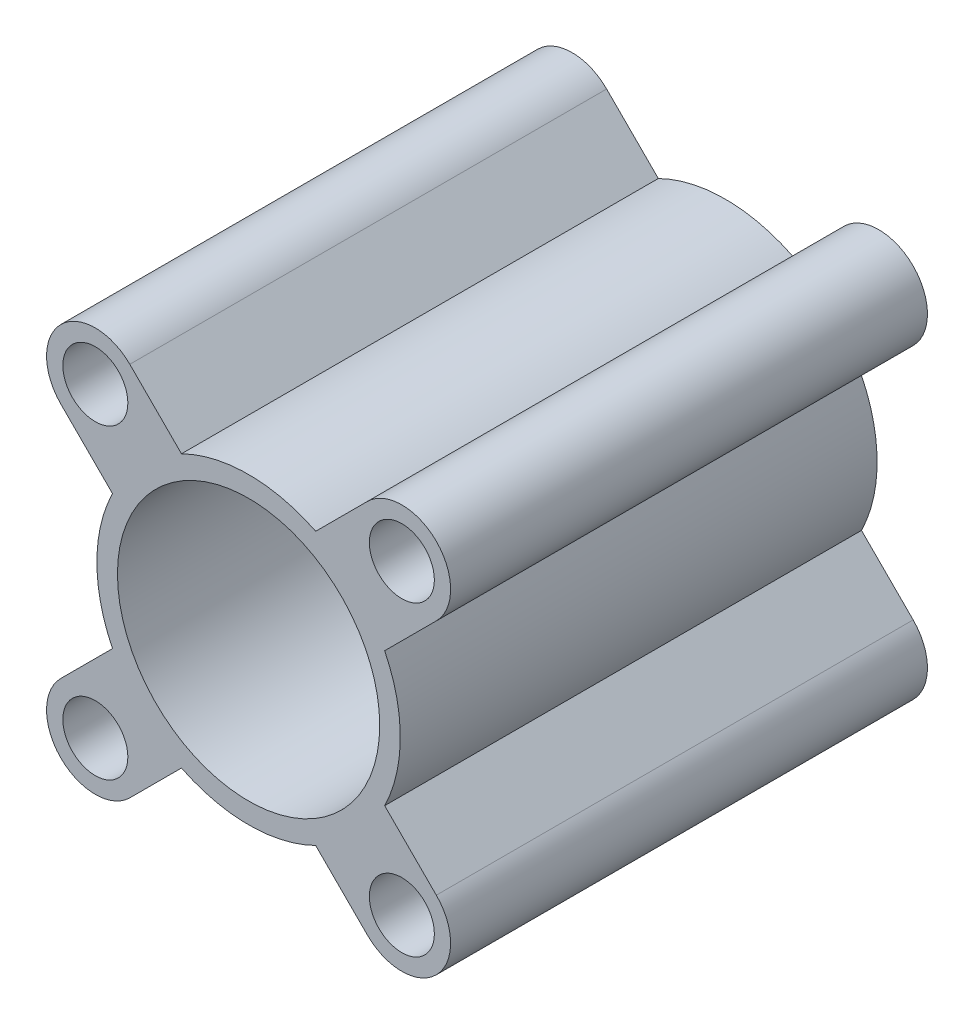
ISO-10303-21;
HEADER;
FILE_DESCRIPTION(('STEP AP214'),'2;1');
FILE_NAME('part.step','',(''),(''),'','','');
FILE_SCHEMA(('AUTOMOTIVE_DESIGN { 1 0 10303 214 1 1 1 1 }'));
ENDSEC;
DATA;
#1=APPLICATION_CONTEXT('core data for automotive mechanical design processes');
#2=APPLICATION_PROTOCOL_DEFINITION('international standard','automotive_design',2000,#1);
#3=PRODUCT_CONTEXT('',#1,'mechanical');
#4=PRODUCT('Part','Part','',(#3));
#5=PRODUCT_RELATED_PRODUCT_CATEGORY('part','',(#4));
#6=PRODUCT_DEFINITION_FORMATION('','',#4);
#7=PRODUCT_DEFINITION_CONTEXT('part definition',#1,'design');
#8=PRODUCT_DEFINITION('design','',#6,#7);
#9=PRODUCT_DEFINITION_SHAPE('','',#8);
#10=(LENGTH_UNIT() NAMED_UNIT(*) SI_UNIT(.MILLI.,.METRE.));
#11=(NAMED_UNIT(*) PLANE_ANGLE_UNIT() SI_UNIT($,.RADIAN.));
#12=(NAMED_UNIT(*) SI_UNIT($,.STERADIAN.) SOLID_ANGLE_UNIT());
#13=UNCERTAINTY_MEASURE_WITH_UNIT(LENGTH_MEASURE(1.E-05),#10,'distance_accuracy_value','');
#14=(GEOMETRIC_REPRESENTATION_CONTEXT(3) GLOBAL_UNCERTAINTY_ASSIGNED_CONTEXT((#13)) GLOBAL_UNIT_ASSIGNED_CONTEXT((#10,
#11,#12)) REPRESENTATION_CONTEXT('',''));
#15=CARTESIAN_POINT('',(0.,0.,0.));
#16=DIRECTION('',(0.,0.,1.));
#17=DIRECTION('',(1.,0.,0.));
#18=AXIS2_PLACEMENT_3D('',#15,#16,#17);
#19=CARTESIAN_POINT('',(1.59092777800197,1.59092777800199,22.));
#20=DIRECTION('',(0.707106781186543,0.707106781186552,0.));
#21=DIRECTION('',(-0.707106781186552,0.707106781186543,0.));
#22=AXIS2_PLACEMENT_3D('',#19,#20,#21);
#23=PLANE('',#22);
#24=DIRECTION('',(0.707106781186552,-0.707106781186543,0.));
#25=VECTOR('',#24,1.);
#26=CARTESIAN_POINT('',(1.59092777800197,1.59092777800199,0.));
#27=LINE('',#26,#25);
#28=CARTESIAN_POINT('',(-5.48014003386354,8.66199558986743,0.));
#29=VERTEX_POINT('',#28);
#30=CARTESIAN_POINT('',(-3.09617674453451,6.27803230053842,0.));
#31=VERTEX_POINT('',#30);
#32=EDGE_CURVE('E220',#29,#31,#27,.T.);
#33=ORIENTED_EDGE('',*,*,#32,.F.);
#34=DIRECTION('',(0.,0.,-1.));
#35=VECTOR('',#34,1.);
#36=CARTESIAN_POINT('',(-5.48014003386354,8.66199558986743,22.));
#37=LINE('',#36,#35);
#38=CARTESIAN_POINT('',(-5.48014003386354,8.66199558986743,22.));
#39=VERTEX_POINT('',#38);
#40=EDGE_CURVE('E11',#39,#29,#37,.T.);
#41=ORIENTED_EDGE('',*,*,#40,.F.);
#42=DIRECTION('',(0.707106781186552,-0.707106781186543,0.));
#43=VECTOR('',#42,1.);
#44=CARTESIAN_POINT('',(1.59092777800197,1.59092777800199,22.));
#45=LINE('',#44,#43);
#46=CARTESIAN_POINT('',(-3.09617674453451,6.27803230053842,22.));
#47=VERTEX_POINT('',#46);
#48=EDGE_CURVE('E376',#39,#47,#45,.T.);
#49=ORIENTED_EDGE('',*,*,#48,.T.);
#50=DIRECTION('',(0.,0.,-1.));
#51=VECTOR('',#50,1.);
#52=CARTESIAN_POINT('',(-3.09617674453451,6.27803230053842,22.));
#53=LINE('',#52,#51);
#54=EDGE_CURVE('E110',#47,#31,#53,.T.);
#55=ORIENTED_EDGE('',*,*,#54,.T.);
#56=EDGE_LOOP('',(#33,#41,#49,#55));
#57=FACE_BOUND('',#56,.T.);
#58=ADVANCED_FACE('F35',(#57),#23,.T.);
#59=CARTESIAN_POINT('',(-7.07106781186552,7.07106781186544,22.));
#60=DIRECTION('',(0.,0.,-1.));
#61=DIRECTION('',(-1.,0.,0.));
#62=AXIS2_PLACEMENT_3D('',#59,#60,#61);
#63=CYLINDRICAL_SURFACE('',#62,2.24991164040649);
#64=CARTESIAN_POINT('',(-7.07106781186552,7.07106781186544,0.));
#65=DIRECTION('',(0.,0.,1.));
#66=DIRECTION('',(1.,0.,0.));
#67=AXIS2_PLACEMENT_3D('',#64,#65,#66);
#68=CIRCLE('',#67,2.24991164040649);
#69=CARTESIAN_POINT('',(-8.66199558986749,5.48014003386345,0.));
#70=VERTEX_POINT('',#69);
#71=EDGE_CURVE('E218',#29,#70,#68,.T.);
#72=ORIENTED_EDGE('',*,*,#71,.T.);
#73=DIRECTION('',(0.,0.,-1.));
#74=VECTOR('',#73,1.);
#75=CARTESIAN_POINT('',(-8.66199558986749,5.48014003386345,22.));
#76=LINE('',#75,#74);
#77=CARTESIAN_POINT('',(-8.66199558986749,5.48014003386345,22.));
#78=VERTEX_POINT('',#77);
#79=EDGE_CURVE('E44',#78,#70,#76,.T.);
#80=ORIENTED_EDGE('',*,*,#79,.F.);
#81=CARTESIAN_POINT('',(-7.07106781186552,7.07106781186544,22.));
#82=DIRECTION('',(0.,0.,1.));
#83=DIRECTION('',(1.,0.,0.));
#84=AXIS2_PLACEMENT_3D('',#81,#82,#83);
#85=CIRCLE('',#84,2.24991164040649);
#86=EDGE_CURVE('E378',#39,#78,#85,.T.);
#87=ORIENTED_EDGE('',*,*,#86,.F.);
#88=ORIENTED_EDGE('',*,*,#40,.T.);
#89=EDGE_LOOP('',(#72,#80,#87,#88));
#90=FACE_BOUND('',#89,.T.);
#91=ADVANCED_FACE('F219',(#90),#63,.T.);
#92=CARTESIAN_POINT('',(-1.59092777800198,-1.59092777800199,22.));
#93=DIRECTION('',(0.707106781186544,0.707106781186551,0.));
#94=DIRECTION('',(-0.707106781186551,0.707106781186544,0.));
#95=AXIS2_PLACEMENT_3D('',#92,#93,#94);
#96=PLANE('',#95);
#97=DIRECTION('',(0.707106781186551,-0.707106781186544,0.));
#98=VECTOR('',#97,1.);
#99=CARTESIAN_POINT('',(-1.59092777800198,-1.59092777800199,0.));
#100=LINE('',#99,#98);
#101=CARTESIAN_POINT('',(-6.27803230053845,3.09617674453444,0.));
#102=VERTEX_POINT('',#101);
#103=EDGE_CURVE('E212',#70,#102,#100,.T.);
#104=ORIENTED_EDGE('',*,*,#103,.T.);
#105=DIRECTION('',(0.,0.,-1.));
#106=VECTOR('',#105,1.);
#107=CARTESIAN_POINT('',(-6.27803230053845,3.09617674453444,22.));
#108=LINE('',#107,#106);
#109=CARTESIAN_POINT('',(-6.27803230053845,3.09617674453444,22.));
#110=VERTEX_POINT('',#109);
#111=EDGE_CURVE('E203',#110,#102,#108,.T.);
#112=ORIENTED_EDGE('',*,*,#111,.F.);
#113=DIRECTION('',(0.707106781186551,-0.707106781186544,0.));
#114=VECTOR('',#113,1.);
#115=CARTESIAN_POINT('',(-1.59092777800198,-1.59092777800199,22.));
#116=LINE('',#115,#114);
#117=EDGE_CURVE('E214',#78,#110,#116,.T.);
#118=ORIENTED_EDGE('',*,*,#117,.F.);
#119=ORIENTED_EDGE('',*,*,#79,.T.);
#120=EDGE_LOOP('',(#104,#112,#118,#119));
#121=FACE_BOUND('',#120,.T.);
#122=ADVANCED_FACE('F210',(#121),#96,.F.);
#123=CARTESIAN_POINT('',(0.,0.,22.));
#124=DIRECTION('',(0.,0.,-1.));
#125=DIRECTION('',(-1.,0.,0.));
#126=AXIS2_PLACEMENT_3D('',#123,#124,#125);
#127=CYLINDRICAL_SURFACE('',#126,7.);
#128=CARTESIAN_POINT('',(0.,0.,0.));
#129=DIRECTION('',(0.,0.,1.));
#130=DIRECTION('',(1.,0.,0.));
#131=AXIS2_PLACEMENT_3D('',#128,#129,#130);
#132=CIRCLE('',#131,7.);
#133=CARTESIAN_POINT('',(-6.27803230053842,-3.0961767445345,0.));
#134=VERTEX_POINT('',#133);
#135=EDGE_CURVE('E222',#102,#134,#132,.T.);
#136=ORIENTED_EDGE('',*,*,#135,.T.);
#137=DIRECTION('',(0.,0.,-1.));
#138=VECTOR('',#137,1.);
#139=CARTESIAN_POINT('',(-6.27803230053842,-3.0961767445345,22.));
#140=LINE('',#139,#138);
#141=CARTESIAN_POINT('',(-6.27803230053842,-3.0961767445345,22.));
#142=VERTEX_POINT('',#141);
#143=EDGE_CURVE('E201',#142,#134,#140,.T.);
#144=ORIENTED_EDGE('',*,*,#143,.F.);
#145=CARTESIAN_POINT('',(0.,0.,22.));
#146=DIRECTION('',(0.,0.,1.));
#147=DIRECTION('',(1.,0.,0.));
#148=AXIS2_PLACEMENT_3D('',#145,#146,#147);
#149=CIRCLE('',#148,7.);
#150=EDGE_CURVE('E384',#110,#142,#149,.T.);
#151=ORIENTED_EDGE('',*,*,#150,.F.);
#152=ORIENTED_EDGE('',*,*,#111,.T.);
#153=EDGE_LOOP('',(#136,#144,#151,#152));
#154=FACE_BOUND('',#153,.T.);
#155=ADVANCED_FACE('F311',(#154),#127,.T.);
#156=CARTESIAN_POINT('',(-1.590927778002,1.59092777800198,22.));
#157=DIRECTION('',(-0.707106781186552,0.707106781186543,0.));
#158=DIRECTION('',(-0.707106781186543,-0.707106781186552,0.));
#159=AXIS2_PLACEMENT_3D('',#156,#157,#158);
#160=PLANE('',#159);
#161=DIRECTION('',(0.707106781186543,0.707106781186552,0.));
#162=VECTOR('',#161,1.);
#163=CARTESIAN_POINT('',(-1.590927778002,1.59092777800198,0.));
#164=LINE('',#163,#162);
#165=CARTESIAN_POINT('',(-8.66199558986743,-5.48014003386354,0.));
#166=VERTEX_POINT('',#165);
#167=EDGE_CURVE('E230',#166,#134,#164,.T.);
#168=ORIENTED_EDGE('',*,*,#167,.F.);
#169=DIRECTION('',(0.,0.,-1.));
#170=VECTOR('',#169,1.);
#171=CARTESIAN_POINT('',(-8.66199558986743,-5.48014003386354,22.));
#172=LINE('',#171,#170);
#173=CARTESIAN_POINT('',(-8.66199558986743,-5.48014003386354,22.));
#174=VERTEX_POINT('',#173);
#175=EDGE_CURVE('E199',#174,#166,#172,.T.);
#176=ORIENTED_EDGE('',*,*,#175,.F.);
#177=DIRECTION('',(0.707106781186543,0.707106781186552,0.));
#178=VECTOR('',#177,1.);
#179=CARTESIAN_POINT('',(-1.590927778002,1.59092777800198,22.));
#180=LINE('',#179,#178);
#181=EDGE_CURVE('E386',#174,#142,#180,.T.);
#182=ORIENTED_EDGE('',*,*,#181,.T.);
#183=ORIENTED_EDGE('',*,*,#143,.T.);
#184=EDGE_LOOP('',(#168,#176,#182,#183));
#185=FACE_BOUND('',#184,.T.);
#186=ADVANCED_FACE('F314',(#185),#160,.T.);
#187=CARTESIAN_POINT('',(-7.07106781186544,-7.07106781186552,22.));
#188=DIRECTION('',(0.,0.,-1.));
#189=DIRECTION('',(-1.,0.,0.));
#190=AXIS2_PLACEMENT_3D('',#187,#188,#189);
#191=CYLINDRICAL_SURFACE('',#190,2.2499116404065);
#192=CARTESIAN_POINT('',(-7.07106781186544,-7.07106781186552,0.));
#193=DIRECTION('',(0.,0.,1.));
#194=DIRECTION('',(1.,0.,0.));
#195=AXIS2_PLACEMENT_3D('',#192,#193,#194);
#196=CIRCLE('',#195,2.2499116404065);
#197=CARTESIAN_POINT('',(-5.48014003386344,-8.66199558986749,0.));
#198=VERTEX_POINT('',#197);
#199=EDGE_CURVE('E233',#166,#198,#196,.T.);
#200=ORIENTED_EDGE('',*,*,#199,.T.);
#201=DIRECTION('',(0.,0.,-1.));
#202=VECTOR('',#201,1.);
#203=CARTESIAN_POINT('',(-5.48014003386344,-8.66199558986749,22.));
#204=LINE('',#203,#202);
#205=CARTESIAN_POINT('',(-5.48014003386344,-8.66199558986749,22.));
#206=VERTEX_POINT('',#205);
#207=EDGE_CURVE('E196',#206,#198,#204,.T.);
#208=ORIENTED_EDGE('',*,*,#207,.F.);
#209=CARTESIAN_POINT('',(-7.07106781186544,-7.07106781186552,22.));
#210=DIRECTION('',(0.,0.,1.));
#211=DIRECTION('',(1.,0.,0.));
#212=AXIS2_PLACEMENT_3D('',#209,#210,#211);
#213=CIRCLE('',#212,2.2499116404065);
#214=EDGE_CURVE('E389',#174,#206,#213,.T.);
#215=ORIENTED_EDGE('',*,*,#214,.F.);
#216=ORIENTED_EDGE('',*,*,#175,.T.);
#217=EDGE_LOOP('',(#200,#208,#215,#216));
#218=FACE_BOUND('',#217,.T.);
#219=ADVANCED_FACE('F318',(#218),#191,.T.);
#220=CARTESIAN_POINT('',(1.59092777800199,-1.59092777800198,22.));
#221=DIRECTION('',(-0.707106781186552,0.707106781186543,0.));
#222=DIRECTION('',(-0.707106781186543,-0.707106781186552,0.));
#223=AXIS2_PLACEMENT_3D('',#220,#221,#222);
#224=PLANE('',#223);
#225=DIRECTION('',(0.707106781186543,0.707106781186552,0.));
#226=VECTOR('',#225,1.);
#227=CARTESIAN_POINT('',(1.59092777800199,-1.59092777800198,0.));
#228=LINE('',#227,#226);
#229=CARTESIAN_POINT('',(-3.09617674453443,-6.27803230053846,0.));
#230=VERTEX_POINT('',#229);
#231=EDGE_CURVE('E236',#198,#230,#228,.T.);
#232=ORIENTED_EDGE('',*,*,#231,.T.);
#233=DIRECTION('',(0.,0.,-1.));
#234=VECTOR('',#233,1.);
#235=CARTESIAN_POINT('',(-3.09617674453443,-6.27803230053846,22.));
#236=LINE('',#235,#234);
#237=CARTESIAN_POINT('',(-3.09617674453443,-6.27803230053846,22.));
#238=VERTEX_POINT('',#237);
#239=EDGE_CURVE('E193',#238,#230,#236,.T.);
#240=ORIENTED_EDGE('',*,*,#239,.F.);
#241=DIRECTION('',(0.707106781186543,0.707106781186552,0.));
#242=VECTOR('',#241,1.);
#243=CARTESIAN_POINT('',(1.59092777800199,-1.59092777800198,22.));
#244=LINE('',#243,#242);
#245=EDGE_CURVE('E392',#206,#238,#244,.T.);
#246=ORIENTED_EDGE('',*,*,#245,.F.);
#247=ORIENTED_EDGE('',*,*,#207,.T.);
#248=EDGE_LOOP('',(#232,#240,#246,#247));
#249=FACE_BOUND('',#248,.T.);
#250=ADVANCED_FACE('F322',(#249),#224,.F.);
#251=CARTESIAN_POINT('',(0.,0.,22.));
#252=DIRECTION('',(0.,0.,-1.));
#253=DIRECTION('',(-1.,0.,0.));
#254=AXIS2_PLACEMENT_3D('',#251,#252,#253);
#255=CYLINDRICAL_SURFACE('',#254,7.);
#256=CARTESIAN_POINT('',(0.,0.,0.));
#257=DIRECTION('',(0.,0.,1.));
#258=DIRECTION('',(1.,0.,0.));
#259=AXIS2_PLACEMENT_3D('',#256,#257,#258);
#260=CIRCLE('',#259,7.);
#261=CARTESIAN_POINT('',(3.0961767445345,-6.27803230053842,0.));
#262=VERTEX_POINT('',#261);
#263=EDGE_CURVE('E239',#230,#262,#260,.T.);
#264=ORIENTED_EDGE('',*,*,#263,.T.);
#265=DIRECTION('',(0.,0.,-1.));
#266=VECTOR('',#265,1.);
#267=CARTESIAN_POINT('',(3.0961767445345,-6.27803230053842,22.));
#268=LINE('',#267,#266);
#269=CARTESIAN_POINT('',(3.0961767445345,-6.27803230053842,22.));
#270=VERTEX_POINT('',#269);
#271=EDGE_CURVE('E191',#270,#262,#268,.T.);
#272=ORIENTED_EDGE('',*,*,#271,.F.);
#273=CARTESIAN_POINT('',(0.,0.,22.));
#274=DIRECTION('',(0.,0.,1.));
#275=DIRECTION('',(1.,0.,0.));
#276=AXIS2_PLACEMENT_3D('',#273,#274,#275);
#277=CIRCLE('',#276,7.);
#278=EDGE_CURVE('E395',#238,#270,#277,.T.);
#279=ORIENTED_EDGE('',*,*,#278,.F.);
#280=ORIENTED_EDGE('',*,*,#239,.T.);
#281=EDGE_LOOP('',(#264,#272,#279,#280));
#282=FACE_BOUND('',#281,.T.);
#283=ADVANCED_FACE('F326',(#282),#255,.T.);
#284=CARTESIAN_POINT('',(-1.59092777800198,-1.59092777800199,22.));
#285=DIRECTION('',(-0.707106781186543,-0.707106781186552,0.));
#286=DIRECTION('',(0.707106781186552,-0.707106781186543,0.));
#287=AXIS2_PLACEMENT_3D('',#284,#285,#286);
#288=PLANE('',#287);
#289=DIRECTION('',(-0.707106781186552,0.707106781186543,0.));
#290=VECTOR('',#289,1.);
#291=CARTESIAN_POINT('',(-1.59092777800198,-1.59092777800199,0.));
#292=LINE('',#291,#290);
#293=CARTESIAN_POINT('',(5.48014003386354,-8.66199558986743,0.));
#294=VERTEX_POINT('',#293);
#295=EDGE_CURVE('E242',#294,#262,#292,.T.);
#296=ORIENTED_EDGE('',*,*,#295,.F.);
#297=DIRECTION('',(0.,0.,-1.));
#298=VECTOR('',#297,1.);
#299=CARTESIAN_POINT('',(5.48014003386354,-8.66199558986743,22.));
#300=LINE('',#299,#298);
#301=CARTESIAN_POINT('',(5.48014003386354,-8.66199558986743,22.));
#302=VERTEX_POINT('',#301);
#303=EDGE_CURVE('E189',#302,#294,#300,.T.);
#304=ORIENTED_EDGE('',*,*,#303,.F.);
#305=DIRECTION('',(-0.707106781186552,0.707106781186543,0.));
#306=VECTOR('',#305,1.);
#307=CARTESIAN_POINT('',(-1.59092777800198,-1.59092777800199,22.));
#308=LINE('',#307,#306);
#309=EDGE_CURVE('E397',#302,#270,#308,.T.);
#310=ORIENTED_EDGE('',*,*,#309,.T.);
#311=ORIENTED_EDGE('',*,*,#271,.T.);
#312=EDGE_LOOP('',(#296,#304,#310,#311));
#313=FACE_BOUND('',#312,.T.);
#314=ADVANCED_FACE('F330',(#313),#288,.T.);
#315=CARTESIAN_POINT('',(7.07106781186552,-7.07106781186544,22.));
#316=DIRECTION('',(0.,0.,-1.));
#317=DIRECTION('',(-1.,0.,0.));
#318=AXIS2_PLACEMENT_3D('',#315,#316,#317);
#319=CYLINDRICAL_SURFACE('',#318,2.2499116404065);
#320=CARTESIAN_POINT('',(7.07106781186552,-7.07106781186544,0.));
#321=DIRECTION('',(0.,0.,1.));
#322=DIRECTION('',(1.,0.,0.));
#323=AXIS2_PLACEMENT_3D('',#320,#321,#322);
#324=CIRCLE('',#323,2.2499116404065);
#325=CARTESIAN_POINT('',(8.66199558986749,-5.48014003386344,0.));
#326=VERTEX_POINT('',#325);
#327=EDGE_CURVE('E245',#294,#326,#324,.T.);
#328=ORIENTED_EDGE('',*,*,#327,.T.);
#329=DIRECTION('',(0.,0.,-1.));
#330=VECTOR('',#329,1.);
#331=CARTESIAN_POINT('',(8.66199558986749,-5.48014003386344,22.));
#332=LINE('',#331,#330);
#333=CARTESIAN_POINT('',(8.66199558986749,-5.48014003386344,22.));
#334=VERTEX_POINT('',#333);
#335=EDGE_CURVE('E186',#334,#326,#332,.T.);
#336=ORIENTED_EDGE('',*,*,#335,.F.);
#337=CARTESIAN_POINT('',(7.07106781186552,-7.07106781186544,22.));
#338=DIRECTION('',(0.,0.,1.));
#339=DIRECTION('',(1.,0.,0.));
#340=AXIS2_PLACEMENT_3D('',#337,#338,#339);
#341=CIRCLE('',#340,2.2499116404065);
#342=EDGE_CURVE('E400',#302,#334,#341,.T.);
#343=ORIENTED_EDGE('',*,*,#342,.F.);
#344=ORIENTED_EDGE('',*,*,#303,.T.);
#345=EDGE_LOOP('',(#328,#336,#343,#344));
#346=FACE_BOUND('',#345,.T.);
#347=ADVANCED_FACE('F334',(#346),#319,.T.);
#348=CARTESIAN_POINT('',(1.59092777800197,1.59092777800199,22.));
#349=DIRECTION('',(-0.707106781186543,-0.707106781186552,0.));
#350=DIRECTION('',(0.707106781186552,-0.707106781186543,0.));
#351=AXIS2_PLACEMENT_3D('',#348,#349,#350);
#352=PLANE('',#351);
#353=DIRECTION('',(-0.707106781186552,0.707106781186543,0.));
#354=VECTOR('',#353,1.);
#355=CARTESIAN_POINT('',(1.59092777800197,1.59092777800199,0.));
#356=LINE('',#355,#354);
#357=CARTESIAN_POINT('',(6.27803230053846,-3.09617674453443,0.));
#358=VERTEX_POINT('',#357);
#359=EDGE_CURVE('E248',#326,#358,#356,.T.);
#360=ORIENTED_EDGE('',*,*,#359,.T.);
#361=DIRECTION('',(0.,0.,-1.));
#362=VECTOR('',#361,1.);
#363=CARTESIAN_POINT('',(6.27803230053846,-3.09617674453443,22.));
#364=LINE('',#363,#362);
#365=CARTESIAN_POINT('',(6.27803230053846,-3.09617674453443,22.));
#366=VERTEX_POINT('',#365);
#367=EDGE_CURVE('E183',#366,#358,#364,.T.);
#368=ORIENTED_EDGE('',*,*,#367,.F.);
#369=DIRECTION('',(-0.707106781186552,0.707106781186543,0.));
#370=VECTOR('',#369,1.);
#371=CARTESIAN_POINT('',(1.59092777800197,1.59092777800199,22.));
#372=LINE('',#371,#370);
#373=EDGE_CURVE('E403',#334,#366,#372,.T.);
#374=ORIENTED_EDGE('',*,*,#373,.F.);
#375=ORIENTED_EDGE('',*,*,#335,.T.);
#376=EDGE_LOOP('',(#360,#368,#374,#375));
#377=FACE_BOUND('',#376,.T.);
#378=ADVANCED_FACE('F338',(#377),#352,.F.);
#379=CARTESIAN_POINT('',(0.,0.,22.));
#380=DIRECTION('',(0.,0.,-1.));
#381=DIRECTION('',(-1.,0.,0.));
#382=AXIS2_PLACEMENT_3D('',#379,#380,#381);
#383=CYLINDRICAL_SURFACE('',#382,7.);
#384=CARTESIAN_POINT('',(0.,0.,0.));
#385=DIRECTION('',(0.,0.,1.));
#386=DIRECTION('',(1.,0.,0.));
#387=AXIS2_PLACEMENT_3D('',#384,#385,#386);
#388=CIRCLE('',#387,7.);
#389=CARTESIAN_POINT('',(6.27803230053842,3.0961767445345,0.));
#390=VERTEX_POINT('',#389);
#391=EDGE_CURVE('E251',#358,#390,#388,.T.);
#392=ORIENTED_EDGE('',*,*,#391,.T.);
#393=DIRECTION('',(0.,0.,-1.));
#394=VECTOR('',#393,1.);
#395=CARTESIAN_POINT('',(6.27803230053842,3.0961767445345,22.));
#396=LINE('',#395,#394);
#397=CARTESIAN_POINT('',(6.27803230053842,3.0961767445345,22.));
#398=VERTEX_POINT('',#397);
#399=EDGE_CURVE('E177',#398,#390,#396,.T.);
#400=ORIENTED_EDGE('',*,*,#399,.F.);
#401=CARTESIAN_POINT('',(0.,0.,22.));
#402=DIRECTION('',(0.,0.,1.));
#403=DIRECTION('',(1.,0.,0.));
#404=AXIS2_PLACEMENT_3D('',#401,#402,#403);
#405=CIRCLE('',#404,7.);
#406=EDGE_CURVE('E406',#366,#398,#405,.T.);
#407=ORIENTED_EDGE('',*,*,#406,.F.);
#408=ORIENTED_EDGE('',*,*,#367,.T.);
#409=EDGE_LOOP('',(#392,#400,#407,#408));
#410=FACE_BOUND('',#409,.T.);
#411=ADVANCED_FACE('F342',(#410),#383,.T.);
#412=CARTESIAN_POINT('',(1.590927778002,-1.59092777800198,22.));
#413=DIRECTION('',(0.707106781186552,-0.707106781186543,0.));
#414=DIRECTION('',(0.707106781186543,0.707106781186552,0.));
#415=AXIS2_PLACEMENT_3D('',#412,#413,#414);
#416=PLANE('',#415);
#417=DIRECTION('',(-0.707106781186543,-0.707106781186552,0.));
#418=VECTOR('',#417,1.);
#419=CARTESIAN_POINT('',(1.590927778002,-1.59092777800198,0.));
#420=LINE('',#419,#418);
#421=CARTESIAN_POINT('',(8.66199558986743,5.48014003386354,0.));
#422=VERTEX_POINT('',#421);
#423=EDGE_CURVE('E254',#422,#390,#420,.T.);
#424=ORIENTED_EDGE('',*,*,#423,.F.);
#425=DIRECTION('',(0.,0.,-1.));
#426=VECTOR('',#425,1.);
#427=CARTESIAN_POINT('',(8.66199558986743,5.48014003386354,22.));
#428=LINE('',#427,#426);
#429=CARTESIAN_POINT('',(8.66199558986743,5.48014003386354,22.));
#430=VERTEX_POINT('',#429);
#431=EDGE_CURVE('E175',#430,#422,#428,.T.);
#432=ORIENTED_EDGE('',*,*,#431,.F.);
#433=DIRECTION('',(-0.707106781186543,-0.707106781186552,0.));
#434=VECTOR('',#433,1.);
#435=CARTESIAN_POINT('',(1.590927778002,-1.59092777800198,22.));
#436=LINE('',#435,#434);
#437=EDGE_CURVE('E169',#430,#398,#436,.T.);
#438=ORIENTED_EDGE('',*,*,#437,.T.);
#439=ORIENTED_EDGE('',*,*,#399,.T.);
#440=EDGE_LOOP('',(#424,#432,#438,#439));
#441=FACE_BOUND('',#440,.T.);
#442=ADVANCED_FACE('F346',(#441),#416,.T.);
#443=CARTESIAN_POINT('',(7.07106781186544,7.07106781186552,22.));
#444=DIRECTION('',(0.,0.,-1.));
#445=DIRECTION('',(-1.,0.,0.));
#446=AXIS2_PLACEMENT_3D('',#443,#444,#445);
#447=CYLINDRICAL_SURFACE('',#446,2.24991164040651);
#448=CARTESIAN_POINT('',(7.07106781186544,7.07106781186552,0.));
#449=DIRECTION('',(0.,0.,1.));
#450=DIRECTION('',(1.,0.,0.));
#451=AXIS2_PLACEMENT_3D('',#448,#449,#450);
#452=CIRCLE('',#451,2.24991164040651);
#453=CARTESIAN_POINT('',(5.48014003386343,8.6619955898675,0.));
#454=VERTEX_POINT('',#453);
#455=EDGE_CURVE('E174',#422,#454,#452,.T.);
#456=ORIENTED_EDGE('',*,*,#455,.T.);
#457=DIRECTION('',(0.,0.,-1.));
#458=VECTOR('',#457,1.);
#459=CARTESIAN_POINT('',(5.48014003386343,8.6619955898675,22.));
#460=LINE('',#459,#458);
#461=CARTESIAN_POINT('',(5.48014003386343,8.6619955898675,22.));
#462=VERTEX_POINT('',#461);
#463=EDGE_CURVE('E159',#462,#454,#460,.T.);
#464=ORIENTED_EDGE('',*,*,#463,.F.);
#465=CARTESIAN_POINT('',(7.07106781186544,7.07106781186552,22.));
#466=DIRECTION('',(0.,0.,1.));
#467=DIRECTION('',(1.,0.,0.));
#468=AXIS2_PLACEMENT_3D('',#465,#466,#467);
#469=CIRCLE('',#468,2.24991164040651);
#470=EDGE_CURVE('E162',#430,#462,#469,.T.);
#471=ORIENTED_EDGE('',*,*,#470,.F.);
#472=ORIENTED_EDGE('',*,*,#431,.T.);
#473=EDGE_LOOP('',(#456,#464,#471,#472));
#474=FACE_BOUND('',#473,.T.);
#475=ADVANCED_FACE('F172',(#474),#447,.T.);
#476=CARTESIAN_POINT('',(-1.590927778002,1.59092777800197,22.));
#477=DIRECTION('',(0.707106781186553,-0.707106781186542,0.));
#478=DIRECTION('',(0.707106781186542,0.707106781186553,0.));
#479=AXIS2_PLACEMENT_3D('',#476,#477,#478);
#480=PLANE('',#479);
#481=DIRECTION('',(-0.707106781186542,-0.707106781186553,0.));
#482=VECTOR('',#481,1.);
#483=CARTESIAN_POINT('',(-1.590927778002,1.59092777800197,0.));
#484=LINE('',#483,#482);
#485=CARTESIAN_POINT('',(3.09617674453442,6.27803230053846,0.));
#486=VERTEX_POINT('',#485);
#487=EDGE_CURVE('E258',#454,#486,#484,.T.);
#488=ORIENTED_EDGE('',*,*,#487,.T.);
#489=DIRECTION('',(0.,0.,-1.));
#490=VECTOR('',#489,1.);
#491=CARTESIAN_POINT('',(3.09617674453442,6.27803230053846,22.));
#492=LINE('',#491,#490);
#493=CARTESIAN_POINT('',(3.09617674453442,6.27803230053846,22.));
#494=VERTEX_POINT('',#493);
#495=EDGE_CURVE('E161',#494,#486,#492,.T.);
#496=ORIENTED_EDGE('',*,*,#495,.F.);
#497=DIRECTION('',(-0.707106781186542,-0.707106781186553,0.));
#498=VECTOR('',#497,1.);
#499=CARTESIAN_POINT('',(-1.590927778002,1.59092777800197,22.));
#500=LINE('',#499,#498);
#501=EDGE_CURVE('E154',#462,#494,#500,.T.);
#502=ORIENTED_EDGE('',*,*,#501,.F.);
#503=ORIENTED_EDGE('',*,*,#463,.T.);
#504=EDGE_LOOP('',(#488,#496,#502,#503));
#505=FACE_BOUND('',#504,.T.);
#506=ADVANCED_FACE('F157',(#505),#480,.F.);
#507=CARTESIAN_POINT('',(7.07106781186544,7.07106781186552,22.));
#508=DIRECTION('',(0.,0.,-1.));
#509=DIRECTION('',(-1.,0.,0.));
#510=AXIS2_PLACEMENT_3D('',#507,#508,#509);
#511=CYLINDRICAL_SURFACE('',#510,1.50000000000003);
#512=CARTESIAN_POINT('',(7.07106781186544,7.07106781186552,22.));
#513=DIRECTION('',(0.,0.,1.));
#514=DIRECTION('',(1.,0.,0.));
#515=AXIS2_PLACEMENT_3D('',#512,#513,#514);
#516=CIRCLE('',#515,1.50000000000003);
#517=CARTESIAN_POINT('',(8.57106781186547,7.07106781186552,22.));
#518=VERTEX_POINT('',#517);
#519=EDGE_CURVE('E272',#518,#518,#516,.T.);
#520=ORIENTED_EDGE('',*,*,#519,.T.);
#521=EDGE_LOOP('',(#520));
#522=FACE_BOUND('',#521,.T.);
#523=CARTESIAN_POINT('',(7.07106781186544,7.07106781186552,0.));
#524=DIRECTION('',(0.,0.,1.));
#525=DIRECTION('',(1.,0.,0.));
#526=AXIS2_PLACEMENT_3D('',#523,#524,#525);
#527=CIRCLE('',#526,1.50000000000003);
#528=CARTESIAN_POINT('',(8.57106781186547,7.07106781186552,0.));
#529=VERTEX_POINT('',#528);
#530=EDGE_CURVE('E264',#529,#529,#527,.T.);
#531=ORIENTED_EDGE('',*,*,#530,.F.);
#532=EDGE_LOOP('',(#531));
#533=FACE_BOUND('',#532,.T.);
#534=ADVANCED_FACE('F354',(#522,#533),#511,.F.);
#535=CARTESIAN_POINT('',(-7.07106781186544,-7.07106781186552,22.));
#536=DIRECTION('',(0.,0.,-1.));
#537=DIRECTION('',(-1.,0.,0.));
#538=AXIS2_PLACEMENT_3D('',#535,#536,#537);
#539=CYLINDRICAL_SURFACE('',#538,1.5);
#540=CARTESIAN_POINT('',(-7.07106781186544,-7.07106781186552,22.));
#541=DIRECTION('',(0.,0.,1.));
#542=DIRECTION('',(1.,0.,0.));
#543=AXIS2_PLACEMENT_3D('',#540,#541,#542);
#544=CIRCLE('',#543,1.5);
#545=CARTESIAN_POINT('',(-5.57106781186544,-7.07106781186552,22.));
#546=VERTEX_POINT('',#545);
#547=EDGE_CURVE('E277',#546,#546,#544,.T.);
#548=ORIENTED_EDGE('',*,*,#547,.T.);
#549=EDGE_LOOP('',(#548));
#550=FACE_BOUND('',#549,.T.);
#551=CARTESIAN_POINT('',(-7.07106781186544,-7.07106781186552,0.));
#552=DIRECTION('',(0.,0.,1.));
#553=DIRECTION('',(1.,0.,0.));
#554=AXIS2_PLACEMENT_3D('',#551,#552,#553);
#555=CIRCLE('',#554,1.5);
#556=CARTESIAN_POINT('',(-5.57106781186544,-7.07106781186552,0.));
#557=VERTEX_POINT('',#556);
#558=EDGE_CURVE('E261',#557,#557,#555,.T.);
#559=ORIENTED_EDGE('',*,*,#558,.F.);
#560=EDGE_LOOP('',(#559));
#561=FACE_BOUND('',#560,.T.);
#562=ADVANCED_FACE('F298',(#550,#561),#539,.F.);
#563=CARTESIAN_POINT('',(0.,0.,22.));
#564=DIRECTION('',(0.,0.,-1.));
#565=DIRECTION('',(-1.,0.,0.));
#566=AXIS2_PLACEMENT_3D('',#563,#564,#565);
#567=CYLINDRICAL_SURFACE('',#566,7.);
#568=CARTESIAN_POINT('',(0.,0.,0.));
#569=DIRECTION('',(0.,0.,1.));
#570=DIRECTION('',(1.,0.,0.));
#571=AXIS2_PLACEMENT_3D('',#568,#569,#570);
#572=CIRCLE('',#571,7.);
#573=EDGE_CURVE('E103',#486,#31,#572,.T.);
#574=ORIENTED_EDGE('',*,*,#573,.T.);
#575=ORIENTED_EDGE('',*,*,#54,.F.);
#576=CARTESIAN_POINT('',(0.,0.,22.));
#577=DIRECTION('',(0.,0.,1.));
#578=DIRECTION('',(1.,0.,0.));
#579=AXIS2_PLACEMENT_3D('',#576,#577,#578);
#580=CIRCLE('',#579,7.);
#581=EDGE_CURVE('E52',#494,#47,#580,.T.);
#582=ORIENTED_EDGE('',*,*,#581,.F.);
#583=ORIENTED_EDGE('',*,*,#495,.T.);
#584=EDGE_LOOP('',(#574,#575,#582,#583));
#585=FACE_BOUND('',#584,.T.);
#586=ADVANCED_FACE('F290',(#585),#567,.T.);
#587=CARTESIAN_POINT('',(-7.07106781186552,7.07106781186544,22.));
#588=DIRECTION('',(0.,0.,-1.));
#589=DIRECTION('',(-1.,0.,0.));
#590=AXIS2_PLACEMENT_3D('',#587,#588,#589);
#591=CYLINDRICAL_SURFACE('',#590,1.5);
#592=CARTESIAN_POINT('',(-7.07106781186552,7.07106781186544,22.));
#593=DIRECTION('',(0.,0.,1.));
#594=DIRECTION('',(1.,0.,0.));
#595=AXIS2_PLACEMENT_3D('',#592,#593,#594);
#596=CIRCLE('',#595,1.5);
#597=CARTESIAN_POINT('',(-5.57106781186551,7.07106781186544,22.));
#598=VERTEX_POINT('',#597);
#599=EDGE_CURVE('E375',#598,#598,#596,.T.);
#600=ORIENTED_EDGE('',*,*,#599,.T.);
#601=EDGE_LOOP('',(#600));
#602=FACE_BOUND('',#601,.T.);
#603=CARTESIAN_POINT('',(-7.07106781186552,7.07106781186544,0.));
#604=DIRECTION('',(0.,0.,1.));
#605=DIRECTION('',(1.,0.,0.));
#606=AXIS2_PLACEMENT_3D('',#603,#604,#605);
#607=CIRCLE('',#606,1.5);
#608=CARTESIAN_POINT('',(-5.57106781186551,7.07106781186544,0.));
#609=VERTEX_POINT('',#608);
#610=EDGE_CURVE('E224',#609,#609,#607,.T.);
#611=ORIENTED_EDGE('',*,*,#610,.F.);
#612=EDGE_LOOP('',(#611));
#613=FACE_BOUND('',#612,.T.);
#614=ADVANCED_FACE('F288',(#602,#613),#591,.F.);
#615=CARTESIAN_POINT('',(0.,0.,22.));
#616=DIRECTION('',(0.,0.,-1.));
#617=DIRECTION('',(-1.,0.,0.));
#618=AXIS2_PLACEMENT_3D('',#615,#616,#617);
#619=CYLINDRICAL_SURFACE('',#618,6.05);
#620=CARTESIAN_POINT('',(0.,0.,22.));
#621=DIRECTION('',(0.,0.,1.));
#622=DIRECTION('',(1.,0.,0.));
#623=AXIS2_PLACEMENT_3D('',#620,#621,#622);
#624=CIRCLE('',#623,6.05);
#625=CARTESIAN_POINT('',(6.05,0.,22.));
#626=VERTEX_POINT('',#625);
#627=EDGE_CURVE('E269',#626,#626,#624,.T.);
#628=ORIENTED_EDGE('',*,*,#627,.T.);
#629=EDGE_LOOP('',(#628));
#630=FACE_BOUND('',#629,.T.);
#631=CARTESIAN_POINT('',(0.,0.,0.));
#632=DIRECTION('',(0.,0.,1.));
#633=DIRECTION('',(1.,0.,0.));
#634=AXIS2_PLACEMENT_3D('',#631,#632,#633);
#635=CIRCLE('',#634,6.05);
#636=CARTESIAN_POINT('',(6.05,0.,0.));
#637=VERTEX_POINT('',#636);
#638=EDGE_CURVE('E281',#637,#637,#635,.T.);
#639=ORIENTED_EDGE('',*,*,#638,.F.);
#640=EDGE_LOOP('',(#639));
#641=FACE_BOUND('',#640,.T.);
#642=ADVANCED_FACE('F37',(#630,#641),#619,.F.);
#643=CARTESIAN_POINT('',(7.07106781186552,-7.07106781186544,22.));
#644=DIRECTION('',(0.,0.,-1.));
#645=DIRECTION('',(-1.,0.,0.));
#646=AXIS2_PLACEMENT_3D('',#643,#644,#645);
#647=CYLINDRICAL_SURFACE('',#646,1.5);
#648=CARTESIAN_POINT('',(7.07106781186552,-7.07106781186544,22.));
#649=DIRECTION('',(0.,0.,1.));
#650=DIRECTION('',(1.,0.,0.));
#651=AXIS2_PLACEMENT_3D('',#648,#649,#650);
#652=CIRCLE('',#651,1.5);
#653=CARTESIAN_POINT('',(8.57106781186552,-7.07106781186544,22.));
#654=VERTEX_POINT('',#653);
#655=EDGE_CURVE('E270',#654,#654,#652,.T.);
#656=ORIENTED_EDGE('',*,*,#655,.T.);
#657=EDGE_LOOP('',(#656));
#658=FACE_BOUND('',#657,.T.);
#659=CARTESIAN_POINT('',(7.07106781186552,-7.07106781186544,0.));
#660=DIRECTION('',(0.,0.,1.));
#661=DIRECTION('',(1.,0.,0.));
#662=AXIS2_PLACEMENT_3D('',#659,#660,#661);
#663=CIRCLE('',#662,1.5);
#664=CARTESIAN_POINT('',(8.57106781186552,-7.07106781186544,0.));
#665=VERTEX_POINT('',#664);
#666=EDGE_CURVE('E267',#665,#665,#663,.T.);
#667=ORIENTED_EDGE('',*,*,#666,.F.);
#668=EDGE_LOOP('',(#667));
#669=FACE_BOUND('',#668,.T.);
#670=ADVANCED_FACE('F296',(#658,#669),#647,.F.);
#671=CARTESIAN_POINT('',(0.,0.,22.));
#672=DIRECTION('',(0.,0.,1.));
#673=DIRECTION('',(1.,0.,0.));
#674=AXIS2_PLACEMENT_3D('',#671,#672,#673);
#675=PLANE('',#674);
#676=ORIENTED_EDGE('',*,*,#627,.F.);
#677=EDGE_LOOP('',(#676));
#678=FACE_BOUND('',#677,.T.);
#679=ORIENTED_EDGE('',*,*,#599,.F.);
#680=EDGE_LOOP('',(#679));
#681=FACE_BOUND('',#680,.T.);
#682=ORIENTED_EDGE('',*,*,#48,.F.);
#683=ORIENTED_EDGE('',*,*,#86,.T.);
#684=ORIENTED_EDGE('',*,*,#117,.T.);
#685=ORIENTED_EDGE('',*,*,#150,.T.);
#686=ORIENTED_EDGE('',*,*,#181,.F.);
#687=ORIENTED_EDGE('',*,*,#214,.T.);
#688=ORIENTED_EDGE('',*,*,#245,.T.);
#689=ORIENTED_EDGE('',*,*,#278,.T.);
#690=ORIENTED_EDGE('',*,*,#309,.F.);
#691=ORIENTED_EDGE('',*,*,#342,.T.);
#692=ORIENTED_EDGE('',*,*,#373,.T.);
#693=ORIENTED_EDGE('',*,*,#406,.T.);
#694=ORIENTED_EDGE('',*,*,#437,.F.);
#695=ORIENTED_EDGE('',*,*,#470,.T.);
#696=ORIENTED_EDGE('',*,*,#501,.T.);
#697=ORIENTED_EDGE('',*,*,#581,.T.);
#698=EDGE_LOOP('',(#682,#683,#684,#685,#686,#687,#688,#689,#690,#691,#692,#693,#694,#695,#696,#697));
#699=FACE_BOUND('',#698,.T.);
#700=ORIENTED_EDGE('',*,*,#547,.F.);
#701=EDGE_LOOP('',(#700));
#702=FACE_BOUND('',#701,.T.);
#703=ORIENTED_EDGE('',*,*,#519,.F.);
#704=EDGE_LOOP('',(#703));
#705=FACE_BOUND('',#704,.T.);
#706=ORIENTED_EDGE('',*,*,#655,.F.);
#707=EDGE_LOOP('',(#706));
#708=FACE_BOUND('',#707,.T.);
#709=ADVANCED_FACE('F166',(#678,#681,#699,#702,#705,#708),#675,.T.);
#710=CARTESIAN_POINT('',(0.,0.,0.));
#711=DIRECTION('',(0.,0.,1.));
#712=DIRECTION('',(1.,0.,0.));
#713=AXIS2_PLACEMENT_3D('',#710,#711,#712);
#714=PLANE('',#713);
#715=ORIENTED_EDGE('',*,*,#638,.T.);
#716=EDGE_LOOP('',(#715));
#717=FACE_BOUND('',#716,.T.);
#718=ORIENTED_EDGE('',*,*,#610,.T.);
#719=EDGE_LOOP('',(#718));
#720=FACE_BOUND('',#719,.T.);
#721=ORIENTED_EDGE('',*,*,#32,.T.);
#722=ORIENTED_EDGE('',*,*,#573,.F.);
#723=ORIENTED_EDGE('',*,*,#487,.F.);
#724=ORIENTED_EDGE('',*,*,#455,.F.);
#725=ORIENTED_EDGE('',*,*,#423,.T.);
#726=ORIENTED_EDGE('',*,*,#391,.F.);
#727=ORIENTED_EDGE('',*,*,#359,.F.);
#728=ORIENTED_EDGE('',*,*,#327,.F.);
#729=ORIENTED_EDGE('',*,*,#295,.T.);
#730=ORIENTED_EDGE('',*,*,#263,.F.);
#731=ORIENTED_EDGE('',*,*,#231,.F.);
#732=ORIENTED_EDGE('',*,*,#199,.F.);
#733=ORIENTED_EDGE('',*,*,#167,.T.);
#734=ORIENTED_EDGE('',*,*,#135,.F.);
#735=ORIENTED_EDGE('',*,*,#103,.F.);
#736=ORIENTED_EDGE('',*,*,#71,.F.);
#737=EDGE_LOOP('',(#721,#722,#723,#724,#725,#726,#727,#728,#729,#730,#731,#732,#733,#734,#735,#736));
#738=FACE_BOUND('',#737,.T.);
#739=ORIENTED_EDGE('',*,*,#558,.T.);
#740=EDGE_LOOP('',(#739));
#741=FACE_BOUND('',#740,.T.);
#742=ORIENTED_EDGE('',*,*,#530,.T.);
#743=EDGE_LOOP('',(#742));
#744=FACE_BOUND('',#743,.T.);
#745=ORIENTED_EDGE('',*,*,#666,.T.);
#746=EDGE_LOOP('',(#745));
#747=FACE_BOUND('',#746,.T.);
#748=ADVANCED_FACE('F286',(#717,#720,#738,#741,#744,#747),#714,.F.);
#749=CLOSED_SHELL('',(#58,#91,#122,#155,#186,#219,#250,#283,#314,#347,#378,#411,#442,#475,#506,
#534,#562,#586,#614,#642,#670,#709,#748));
#750=MANIFOLD_SOLID_BREP('B2',#749);
#751=ADVANCED_BREP_SHAPE_REPRESENTATION('',(#18,#750),#14);
#752=SHAPE_DEFINITION_REPRESENTATION(#9,#751);
ENDSEC;
END-ISO-10303-21;
